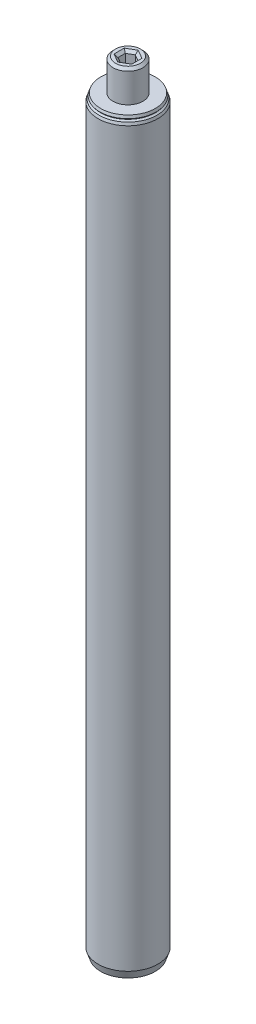
ISO-10303-21;
HEADER;
FILE_DESCRIPTION(('STEP AP214'),'2;1');
FILE_NAME('part.step','',(''),(''),'','','');
FILE_SCHEMA(('AUTOMOTIVE_DESIGN { 1 0 10303 214 1 1 1 1 }'));
ENDSEC;
DATA;
#1=APPLICATION_CONTEXT('core data for automotive mechanical design processes');
#2=APPLICATION_PROTOCOL_DEFINITION('international standard','automotive_design',2000,#1);
#3=PRODUCT_CONTEXT('',#1,'mechanical');
#4=PRODUCT('Part','Part','',(#3));
#5=PRODUCT_RELATED_PRODUCT_CATEGORY('part','',(#4));
#6=PRODUCT_DEFINITION_FORMATION('','',#4);
#7=PRODUCT_DEFINITION_CONTEXT('part definition',#1,'design');
#8=PRODUCT_DEFINITION('design','',#6,#7);
#9=PRODUCT_DEFINITION_SHAPE('','',#8);
#10=(LENGTH_UNIT() NAMED_UNIT(*) SI_UNIT(.MILLI.,.METRE.));
#11=(NAMED_UNIT(*) PLANE_ANGLE_UNIT() SI_UNIT($,.RADIAN.));
#12=(NAMED_UNIT(*) SI_UNIT($,.STERADIAN.) SOLID_ANGLE_UNIT());
#13=UNCERTAINTY_MEASURE_WITH_UNIT(LENGTH_MEASURE(1.E-05),#10,'distance_accuracy_value','');
#14=(GEOMETRIC_REPRESENTATION_CONTEXT(3) GLOBAL_UNCERTAINTY_ASSIGNED_CONTEXT((#13)) GLOBAL_UNIT_ASSIGNED_CONTEXT((#10,
#11,#12)) REPRESENTATION_CONTEXT('',''));
#15=CARTESIAN_POINT('',(0.,0.,0.));
#16=DIRECTION('',(0.,0.,1.));
#17=DIRECTION('',(1.,0.,0.));
#18=AXIS2_PLACEMENT_3D('',#15,#16,#17);
#19=CARTESIAN_POINT('',(-1.29903810567666,70.1812,0.749999999999999));
#20=DIRECTION('',(0.,1.,0.));
#21=DIRECTION('',(0.5,0.,0.866025403784439));
#22=AXIS2_PLACEMENT_3D('',#19,#20,#21);
#23=PLANE('',#22);
#24=CARTESIAN_POINT('',(0.,70.1812,0.));
#25=DIRECTION('',(0.,1.,0.));
#26=DIRECTION('',(0.5,0.,0.866025403784439));
#27=AXIS2_PLACEMENT_3D('',#24,#25,#26);
#28=CIRCLE('',#27,1.246);
#29=CARTESIAN_POINT('',(0.623,70.1812,1.07906765311541));
#30=VERTEX_POINT('',#29);
#31=EDGE_CURVE('P0_E126',#30,#30,#28,.F.);
#32=ORIENTED_EDGE('',*,*,#31,.T.);
#33=EDGE_LOOP('',(#32));
#34=FACE_BOUND('',#33,.T.);
#35=ADVANCED_FACE('P0_F16',(#34),#23,.F.);
#36=CARTESIAN_POINT('',(0.,78.1812,0.));
#37=DIRECTION('',(0.,-1.,0.));
#38=DIRECTION('',(-0.5,0.,-0.866025403784439));
#39=AXIS2_PLACEMENT_3D('',#36,#37,#38);
#40=PLANE('',#39);
#41=DIRECTION('',(0.866025403784439,0.,0.5));
#42=VECTOR('',#41,1.);
#43=CARTESIAN_POINT('',(0.444500000000001,78.1812,-0.769896583964367));
#44=LINE('',#43,#42);
#45=CARTESIAN_POINT('',(0.,78.1812,-1.02652877861916));
#46=VERTEX_POINT('',#45);
#47=CARTESIAN_POINT('',(0.889000000000001,78.1812,-0.513264389309577));
#48=VERTEX_POINT('',#47);
#49=EDGE_CURVE('P0_E157',#46,#48,#44,.T.);
#50=ORIENTED_EDGE('',*,*,#49,.T.);
#51=DIRECTION('',(0.,0.,1.));
#52=VECTOR('',#51,1.);
#53=CARTESIAN_POINT('',(0.889000000000001,78.1812,0.));
#54=LINE('',#53,#52);
#55=CARTESIAN_POINT('',(0.889000000000001,78.1812,0.513264389309578));
#56=VERTEX_POINT('',#55);
#57=EDGE_CURVE('P0_E159',#48,#56,#54,.T.);
#58=ORIENTED_EDGE('',*,*,#57,.T.);
#59=DIRECTION('',(-0.866025403784439,0.,0.5));
#60=VECTOR('',#59,1.);
#61=CARTESIAN_POINT('',(0.4445,78.1812,0.769896583964367));
#62=LINE('',#61,#60);
#63=CARTESIAN_POINT('',(0.,78.1812,1.02652877861916));
#64=VERTEX_POINT('',#63);
#65=EDGE_CURVE('P0_E149',#56,#64,#62,.T.);
#66=ORIENTED_EDGE('',*,*,#65,.T.);
#67=DIRECTION('',(-0.866025403784439,0.,-0.5));
#68=VECTOR('',#67,1.);
#69=CARTESIAN_POINT('',(-0.444500000000001,78.1812,0.769896583964367));
#70=LINE('',#69,#68);
#71=CARTESIAN_POINT('',(-0.889000000000001,78.1812,0.513264389309578));
#72=VERTEX_POINT('',#71);
#73=EDGE_CURVE('P0_E151',#64,#72,#70,.T.);
#74=ORIENTED_EDGE('',*,*,#73,.T.);
#75=DIRECTION('',(0.,0.,-1.));
#76=VECTOR('',#75,1.);
#77=CARTESIAN_POINT('',(-0.889000000000001,78.1812,0.));
#78=LINE('',#77,#76);
#79=CARTESIAN_POINT('',(-0.889000000000001,78.1812,-0.513264389309578));
#80=VERTEX_POINT('',#79);
#81=EDGE_CURVE('P0_E153',#72,#80,#78,.T.);
#82=ORIENTED_EDGE('',*,*,#81,.T.);
#83=DIRECTION('',(0.866025403784439,0.,-0.499999999999999));
#84=VECTOR('',#83,1.);
#85=CARTESIAN_POINT('',(-0.4445,78.1812,-0.769896583964367));
#86=LINE('',#85,#84);
#87=EDGE_CURVE('P0_E155',#80,#46,#86,.T.);
#88=ORIENTED_EDGE('',*,*,#87,.T.);
#89=EDGE_LOOP('',(#50,#58,#66,#74,#82,#88));
#90=FACE_BOUND('',#89,.T.);
#91=CARTESIAN_POINT('',(0.,78.1812,0.));
#92=DIRECTION('',(0.,-1.,0.));
#93=DIRECTION('',(-0.5,0.,-0.866025403784439));
#94=AXIS2_PLACEMENT_3D('',#91,#92,#93);
#95=CIRCLE('',#94,1.246);
#96=CARTESIAN_POINT('',(-0.623,78.1812,-1.07906765311541));
#97=VERTEX_POINT('',#96);
#98=EDGE_CURVE('P0_E143',#97,#97,#95,.F.);
#99=ORIENTED_EDGE('',*,*,#98,.T.);
#100=EDGE_LOOP('',(#99));
#101=FACE_BOUND('',#100,.T.);
#102=ADVANCED_FACE('P0_F208',(#90,#101),#40,.F.);
#103=CARTESIAN_POINT('',(0.,70.1812,0.));
#104=DIRECTION('',(0.,-1.,0.));
#105=DIRECTION('',(-0.5,0.,-0.866025403784439));
#106=AXIS2_PLACEMENT_3D('',#103,#104,#105);
#107=CYLINDRICAL_SURFACE('',#106,1.5);
#108=CARTESIAN_POINT('',(0.,70.4352,0.));
#109=DIRECTION('',(0.,1.,0.));
#110=DIRECTION('',(0.5,0.,0.866025403784439));
#111=AXIS2_PLACEMENT_3D('',#108,#109,#110);
#112=CIRCLE('',#111,1.5);
#113=CARTESIAN_POINT('',(0.749999999999999,70.4352,1.29903810567666));
#114=VERTEX_POINT('',#113);
#115=EDGE_CURVE('P0_E140',#114,#114,#112,.T.);
#116=ORIENTED_EDGE('',*,*,#115,.T.);
#117=EDGE_LOOP('',(#116));
#118=FACE_BOUND('',#117,.T.);
#119=CARTESIAN_POINT('',(0.,77.9272,0.));
#120=DIRECTION('',(0.,-1.,0.));
#121=DIRECTION('',(-0.5,0.,-0.866025403784439));
#122=AXIS2_PLACEMENT_3D('',#119,#120,#121);
#123=CIRCLE('',#122,1.5);
#124=CARTESIAN_POINT('',(-0.749999999999999,77.9272,-1.29903810567666));
#125=VERTEX_POINT('',#124);
#126=EDGE_CURVE('P0_E137',#125,#125,#123,.T.);
#127=ORIENTED_EDGE('',*,*,#126,.T.);
#128=EDGE_LOOP('',(#127));
#129=FACE_BOUND('',#128,.T.);
#130=ADVANCED_FACE('P0_F211',(#118,#129),#107,.T.);
#131=CARTESIAN_POINT('',(0.,70.1812,0.));
#132=DIRECTION('',(0.,1.,0.));
#133=DIRECTION('',(0.5,0.,0.866025403784439));
#134=AXIS2_PLACEMENT_3D('',#131,#132,#133);
#135=CONICAL_SURFACE('',#134,1.246,0.785398163397446);
#136=ORIENTED_EDGE('',*,*,#115,.F.);
#137=EDGE_LOOP('',(#136));
#138=FACE_BOUND('',#137,.T.);
#139=ORIENTED_EDGE('',*,*,#31,.F.);
#140=EDGE_LOOP('',(#139));
#141=FACE_BOUND('',#140,.T.);
#142=ADVANCED_FACE('P0_F218',(#138,#141),#135,.T.);
#143=CARTESIAN_POINT('',(0.,77.9272,0.));
#144=DIRECTION('',(0.,-1.,0.));
#145=DIRECTION('',(-0.5,0.,-0.866025403784439));
#146=AXIS2_PLACEMENT_3D('',#143,#144,#145);
#147=CONICAL_SURFACE('',#146,1.5,0.785398163397447);
#148=ORIENTED_EDGE('',*,*,#98,.F.);
#149=EDGE_LOOP('',(#148));
#150=FACE_BOUND('',#149,.T.);
#151=ORIENTED_EDGE('',*,*,#126,.F.);
#152=EDGE_LOOP('',(#151));
#153=FACE_BOUND('',#152,.T.);
#154=ADVANCED_FACE('P0_F215',(#150,#153),#147,.T.);
#155=CARTESIAN_POINT('',(0.635,76.9112,-0.366617420935412));
#156=DIRECTION('',(0.5,0.,-0.866025403784438));
#157=DIRECTION('',(-0.866025403784439,0.,-0.5));
#158=AXIS2_PLACEMENT_3D('',#155,#156,#157);
#159=PLANE('',#158);
#160=DIRECTION('',(0.,1.,0.));
#161=VECTOR('',#160,1.);
#162=CARTESIAN_POINT('',(0.635,76.9112,-0.366617420935412));
#163=LINE('',#162,#161);
#164=CARTESIAN_POINT('',(0.635,76.9112,-0.366617420935412));
#165=VERTEX_POINT('',#164);
#166=CARTESIAN_POINT('',(0.635,77.9272,-0.366617420935412));
#167=VERTEX_POINT('',#166);
#168=EDGE_CURVE('P0_E124',#165,#167,#163,.T.);
#169=ORIENTED_EDGE('',*,*,#168,.T.);
#170=DIRECTION('',(-0.866025403784439,0.,-0.5));
#171=VECTOR('',#170,1.);
#172=CARTESIAN_POINT('',(0.635,77.9272,-0.366617420935412));
#173=LINE('',#172,#171);
#174=CARTESIAN_POINT('',(0.,77.9272,-0.733234841870825));
#175=VERTEX_POINT('',#174);
#176=EDGE_CURVE('P0_E96',#167,#175,#173,.T.);
#177=ORIENTED_EDGE('',*,*,#176,.T.);
#178=DIRECTION('',(0.,1.,0.));
#179=VECTOR('',#178,1.);
#180=CARTESIAN_POINT('',(0.,76.9112,-0.733234841870825));
#181=LINE('',#180,#179);
#182=CARTESIAN_POINT('',(0.,76.9112,-0.733234841870825));
#183=VERTEX_POINT('',#182);
#184=EDGE_CURVE('P0_E88',#183,#175,#181,.T.);
#185=ORIENTED_EDGE('',*,*,#184,.F.);
#186=DIRECTION('',(-0.866025403784439,0.,-0.5));
#187=VECTOR('',#186,1.);
#188=CARTESIAN_POINT('',(0.635,76.9112,-0.366617420935412));
#189=LINE('',#188,#187);
#190=EDGE_CURVE('P0_E93',#165,#183,#189,.T.);
#191=ORIENTED_EDGE('',*,*,#190,.F.);
#192=EDGE_LOOP('',(#169,#177,#185,#191));
#193=FACE_BOUND('',#192,.T.);
#194=ADVANCED_FACE('P0_F91',(#193),#159,.F.);
#195=CARTESIAN_POINT('',(0.635,76.9112,0.366617420935413));
#196=DIRECTION('',(1.,0.,0.));
#197=DIRECTION('',(0.,0.,-1.));
#198=AXIS2_PLACEMENT_3D('',#195,#196,#197);
#199=PLANE('',#198);
#200=DIRECTION('',(0.,1.,0.));
#201=VECTOR('',#200,1.);
#202=CARTESIAN_POINT('',(0.635,76.9112,0.366617420935413));
#203=LINE('',#202,#201);
#204=CARTESIAN_POINT('',(0.635,76.9112,0.366617420935413));
#205=VERTEX_POINT('',#204);
#206=CARTESIAN_POINT('',(0.635,77.9272,0.366617420935413));
#207=VERTEX_POINT('',#206);
#208=EDGE_CURVE('P0_E127',#205,#207,#203,.T.);
#209=ORIENTED_EDGE('',*,*,#208,.T.);
#210=DIRECTION('',(0.,0.,-1.));
#211=VECTOR('',#210,1.);
#212=CARTESIAN_POINT('',(0.635,77.9272,0.366617420935413));
#213=LINE('',#212,#211);
#214=EDGE_CURVE('P0_E146',#207,#167,#213,.T.);
#215=ORIENTED_EDGE('',*,*,#214,.T.);
#216=ORIENTED_EDGE('',*,*,#168,.F.);
#217=DIRECTION('',(0.,0.,-1.));
#218=VECTOR('',#217,1.);
#219=CARTESIAN_POINT('',(0.635,76.9112,0.366617420935413));
#220=LINE('',#219,#218);
#221=EDGE_CURVE('P0_E100',#205,#165,#220,.T.);
#222=ORIENTED_EDGE('',*,*,#221,.F.);
#223=EDGE_LOOP('',(#209,#215,#216,#222));
#224=FACE_BOUND('',#223,.T.);
#225=ADVANCED_FACE('P0_F199',(#224),#199,.F.);
#226=CARTESIAN_POINT('',(0.,76.9112,0.733234841870825));
#227=DIRECTION('',(0.5,0.,0.866025403784439));
#228=DIRECTION('',(0.866025403784439,0.,-0.5));
#229=AXIS2_PLACEMENT_3D('',#226,#227,#228);
#230=PLANE('',#229);
#231=DIRECTION('',(0.,1.,0.));
#232=VECTOR('',#231,1.);
#233=CARTESIAN_POINT('',(0.,76.9112,0.733234841870825));
#234=LINE('',#233,#232);
#235=CARTESIAN_POINT('',(0.,76.9112,0.733234841870825));
#236=VERTEX_POINT('',#235);
#237=CARTESIAN_POINT('',(0.,77.9272,0.733234841870825));
#238=VERTEX_POINT('',#237);
#239=EDGE_CURVE('P0_E130',#236,#238,#234,.T.);
#240=ORIENTED_EDGE('',*,*,#239,.T.);
#241=DIRECTION('',(0.866025403784439,0.,-0.5));
#242=VECTOR('',#241,1.);
#243=CARTESIAN_POINT('',(0.,77.9272,0.733234841870825));
#244=LINE('',#243,#242);
#245=EDGE_CURVE('P0_E10',#238,#207,#244,.T.);
#246=ORIENTED_EDGE('',*,*,#245,.T.);
#247=ORIENTED_EDGE('',*,*,#208,.F.);
#248=DIRECTION('',(0.866025403784439,0.,-0.5));
#249=VECTOR('',#248,1.);
#250=CARTESIAN_POINT('',(0.,76.9112,0.733234841870825));
#251=LINE('',#250,#249);
#252=EDGE_CURVE('P0_E121',#236,#205,#251,.T.);
#253=ORIENTED_EDGE('',*,*,#252,.F.);
#254=EDGE_LOOP('',(#240,#246,#247,#253));
#255=FACE_BOUND('',#254,.T.);
#256=ADVANCED_FACE('P0_F196',(#255),#230,.F.);
#257=CARTESIAN_POINT('',(-0.635,76.9112,0.366617420935412));
#258=DIRECTION('',(-0.5,0.,0.866025403784438));
#259=DIRECTION('',(0.866025403784438,0.,0.5));
#260=AXIS2_PLACEMENT_3D('',#257,#258,#259);
#261=PLANE('',#260);
#262=DIRECTION('',(0.,1.,0.));
#263=VECTOR('',#262,1.);
#264=CARTESIAN_POINT('',(-0.635,76.9112,0.366617420935412));
#265=LINE('',#264,#263);
#266=CARTESIAN_POINT('',(-0.635,76.9112,0.366617420935412));
#267=VERTEX_POINT('',#266);
#268=CARTESIAN_POINT('',(-0.635,77.9272,0.366617420935412));
#269=VERTEX_POINT('',#268);
#270=EDGE_CURVE('P0_E132',#267,#269,#265,.T.);
#271=ORIENTED_EDGE('',*,*,#270,.T.);
#272=DIRECTION('',(0.866025403784438,0.,0.5));
#273=VECTOR('',#272,1.);
#274=CARTESIAN_POINT('',(-0.635,77.9272,0.366617420935412));
#275=LINE('',#274,#273);
#276=EDGE_CURVE('P0_E25',#269,#238,#275,.T.);
#277=ORIENTED_EDGE('',*,*,#276,.T.);
#278=ORIENTED_EDGE('',*,*,#239,.F.);
#279=DIRECTION('',(0.866025403784439,0.,0.5));
#280=VECTOR('',#279,1.);
#281=CARTESIAN_POINT('',(-0.635,76.9112,0.366617420935412));
#282=LINE('',#281,#280);
#283=EDGE_CURVE('P0_E118',#267,#236,#282,.T.);
#284=ORIENTED_EDGE('',*,*,#283,.F.);
#285=EDGE_LOOP('',(#271,#277,#278,#284));
#286=FACE_BOUND('',#285,.T.);
#287=ADVANCED_FACE('P0_F263',(#286),#261,.F.);
#288=CARTESIAN_POINT('',(-0.635,76.9112,-0.366617420935413));
#289=DIRECTION('',(-1.,0.,0.));
#290=DIRECTION('',(0.,0.,1.));
#291=AXIS2_PLACEMENT_3D('',#288,#289,#290);
#292=PLANE('',#291);
#293=DIRECTION('',(0.,1.,0.));
#294=VECTOR('',#293,1.);
#295=CARTESIAN_POINT('',(-0.635,76.9112,-0.366617420935413));
#296=LINE('',#295,#294);
#297=CARTESIAN_POINT('',(-0.635,76.9112,-0.366617420935413));
#298=VERTEX_POINT('',#297);
#299=CARTESIAN_POINT('',(-0.635,77.9272,-0.366617420935413));
#300=VERTEX_POINT('',#299);
#301=EDGE_CURVE('P0_E99',#298,#300,#296,.T.);
#302=ORIENTED_EDGE('',*,*,#301,.T.);
#303=DIRECTION('',(0.,0.,1.));
#304=VECTOR('',#303,1.);
#305=CARTESIAN_POINT('',(-0.635,77.9272,-0.366617420935413));
#306=LINE('',#305,#304);
#307=EDGE_CURVE('P0_E40',#300,#269,#306,.T.);
#308=ORIENTED_EDGE('',*,*,#307,.T.);
#309=ORIENTED_EDGE('',*,*,#270,.F.);
#310=DIRECTION('',(0.,0.,1.));
#311=VECTOR('',#310,1.);
#312=CARTESIAN_POINT('',(-0.635,76.9112,-0.366617420935413));
#313=LINE('',#312,#311);
#314=EDGE_CURVE('P0_E108',#298,#267,#313,.T.);
#315=ORIENTED_EDGE('',*,*,#314,.F.);
#316=EDGE_LOOP('',(#302,#308,#309,#315));
#317=FACE_BOUND('',#316,.T.);
#318=ADVANCED_FACE('P0_F256',(#317),#292,.F.);
#319=CARTESIAN_POINT('',(0.,76.9112,-0.733234841870825));
#320=DIRECTION('',(-0.499999999999999,0.,-0.866025403784439));
#321=DIRECTION('',(-0.866025403784439,0.,0.499999999999999));
#322=AXIS2_PLACEMENT_3D('',#319,#320,#321);
#323=PLANE('',#322);
#324=ORIENTED_EDGE('',*,*,#184,.T.);
#325=DIRECTION('',(-0.866025403784439,0.,0.499999999999999));
#326=VECTOR('',#325,1.);
#327=CARTESIAN_POINT('',(0.,77.9272,-0.733234841870825));
#328=LINE('',#327,#326);
#329=EDGE_CURVE('P0_E163',#175,#300,#328,.T.);
#330=ORIENTED_EDGE('',*,*,#329,.T.);
#331=ORIENTED_EDGE('',*,*,#301,.F.);
#332=DIRECTION('',(-0.866025403784439,0.,0.499999999999999));
#333=VECTOR('',#332,1.);
#334=CARTESIAN_POINT('',(0.,76.9112,-0.733234841870825));
#335=LINE('',#334,#333);
#336=EDGE_CURVE('P0_E103',#183,#298,#335,.T.);
#337=ORIENTED_EDGE('',*,*,#336,.F.);
#338=EDGE_LOOP('',(#324,#330,#331,#337));
#339=FACE_BOUND('',#338,.T.);
#340=ADVANCED_FACE('P0_F104',(#339),#323,.F.);
#341=CARTESIAN_POINT('',(1.27,76.9112,0.));
#342=DIRECTION('',(0.,-1.,0.));
#343=DIRECTION('',(-0.5,0.,-0.866025403784439));
#344=AXIS2_PLACEMENT_3D('',#341,#342,#343);
#345=PLANE('',#344);
#346=ORIENTED_EDGE('',*,*,#190,.T.);
#347=ORIENTED_EDGE('',*,*,#336,.T.);
#348=ORIENTED_EDGE('',*,*,#314,.T.);
#349=ORIENTED_EDGE('',*,*,#283,.T.);
#350=ORIENTED_EDGE('',*,*,#252,.T.);
#351=ORIENTED_EDGE('',*,*,#221,.T.);
#352=EDGE_LOOP('',(#346,#347,#348,#349,#350,#351));
#353=FACE_BOUND('',#352,.T.);
#354=ADVANCED_FACE('P0_F110',(#353),#345,.F.);
#355=CARTESIAN_POINT('',(-0.635,77.9272,-0.366617420935413));
#356=DIRECTION('',(-0.707106781186546,-0.707106781186549,0.));
#357=DIRECTION('',(0.654653670707978,-0.654653670707976,-0.377964473009228));
#358=AXIS2_PLACEMENT_3D('',#355,#356,#357);
#359=PLANE('',#358);
#360=DIRECTION('',(-0.654653670707978,0.654653670707976,-0.377964473009228));
#361=VECTOR('',#360,1.);
#362=CARTESIAN_POINT('',(-0.453571428571428,77.7457714285714,-0.261869586382437));
#363=LINE('',#362,#361);
#364=EDGE_CURVE('P0_E115',#80,#300,#363,.F.);
#365=ORIENTED_EDGE('',*,*,#364,.F.);
#366=ORIENTED_EDGE('',*,*,#81,.F.);
#367=DIRECTION('',(-0.654653670707979,0.654653670707976,0.377964473009227));
#368=VECTOR('',#367,1.);
#369=CARTESIAN_POINT('',(-0.453571428571428,77.7457714285714,0.261869586382437));
#370=LINE('',#369,#368);
#371=EDGE_CURVE('P0_E20',#269,#72,#370,.T.);
#372=ORIENTED_EDGE('',*,*,#371,.F.);
#373=ORIENTED_EDGE('',*,*,#307,.F.);
#374=EDGE_LOOP('',(#365,#366,#372,#373));
#375=FACE_BOUND('',#374,.T.);
#376=ADVANCED_FACE('P0_F18',(#375),#359,.F.);
#377=CARTESIAN_POINT('',(-0.635,77.9272,0.366617420935412));
#378=DIRECTION('',(-0.353553390593273,-0.707106781186549,0.612372435695793));
#379=DIRECTION('',(0.654653670707978,-0.654653670707976,-0.377964473009227));
#380=AXIS2_PLACEMENT_3D('',#377,#378,#379);
#381=PLANE('',#380);
#382=ORIENTED_EDGE('',*,*,#371,.T.);
#383=ORIENTED_EDGE('',*,*,#73,.F.);
#384=DIRECTION('',(0.,0.654653670707976,0.755928946018456));
#385=VECTOR('',#384,1.);
#386=CARTESIAN_POINT('',(0.,77.7457714285714,0.523739172764874));
#387=LINE('',#386,#385);
#388=EDGE_CURVE('P0_E174',#238,#64,#387,.T.);
#389=ORIENTED_EDGE('',*,*,#388,.F.);
#390=ORIENTED_EDGE('',*,*,#276,.F.);
#391=EDGE_LOOP('',(#382,#383,#389,#390));
#392=FACE_BOUND('',#391,.T.);
#393=ADVANCED_FACE('P0_F188',(#392),#381,.F.);
#394=CARTESIAN_POINT('',(0.,77.9272,-0.733234841870825));
#395=DIRECTION('',(-0.353553390593273,-0.707106781186549,-0.612372435695793));
#396=DIRECTION('',(-0.353553390593274,0.707106781186546,-0.612372435695796));
#397=AXIS2_PLACEMENT_3D('',#394,#395,#396);
#398=PLANE('',#397);
#399=ORIENTED_EDGE('',*,*,#364,.T.);
#400=ORIENTED_EDGE('',*,*,#329,.F.);
#401=DIRECTION('',(0.,0.654653670707976,-0.755928946018456));
#402=VECTOR('',#401,1.);
#403=CARTESIAN_POINT('',(0.,77.7457714285714,-0.523739172764874));
#404=LINE('',#403,#402);
#405=EDGE_CURVE('P0_E171',#46,#175,#404,.F.);
#406=ORIENTED_EDGE('',*,*,#405,.F.);
#407=ORIENTED_EDGE('',*,*,#87,.F.);
#408=EDGE_LOOP('',(#399,#400,#406,#407));
#409=FACE_BOUND('',#408,.T.);
#410=ADVANCED_FACE('P0_F180',(#409),#398,.F.);
#411=CARTESIAN_POINT('',(0.,77.9272,0.733234841870825));
#412=DIRECTION('',(0.353553390593273,-0.707106781186549,0.612372435695794));
#413=DIRECTION('',(-0.353553390593274,-0.707106781186546,-0.612372435695796));
#414=AXIS2_PLACEMENT_3D('',#411,#412,#413);
#415=PLANE('',#414);
#416=ORIENTED_EDGE('',*,*,#388,.T.);
#417=ORIENTED_EDGE('',*,*,#65,.F.);
#418=DIRECTION('',(-0.654653670707978,-0.654653670707976,-0.377964473009228));
#419=VECTOR('',#418,1.);
#420=CARTESIAN_POINT('',(0.635,77.9272,0.366617420935413));
#421=LINE('',#420,#419);
#422=EDGE_CURVE('P0_E169',#207,#56,#421,.F.);
#423=ORIENTED_EDGE('',*,*,#422,.F.);
#424=ORIENTED_EDGE('',*,*,#245,.F.);
#425=EDGE_LOOP('',(#416,#417,#423,#424));
#426=FACE_BOUND('',#425,.T.);
#427=ADVANCED_FACE('P0_F193',(#426),#415,.F.);
#428=CARTESIAN_POINT('',(0.635,77.9272,-0.366617420935412));
#429=DIRECTION('',(0.353553390593273,-0.707106781186549,-0.612372435695793));
#430=DIRECTION('',(0.654653670707978,0.654653670707976,-0.377964473009227));
#431=AXIS2_PLACEMENT_3D('',#428,#429,#430);
#432=PLANE('',#431);
#433=ORIENTED_EDGE('',*,*,#405,.T.);
#434=ORIENTED_EDGE('',*,*,#176,.F.);
#435=DIRECTION('',(0.654653670707979,0.654653670707976,-0.377964473009227));
#436=VECTOR('',#435,1.);
#437=CARTESIAN_POINT('',(0.453571428571428,77.7457714285714,-0.261869586382437));
#438=LINE('',#437,#436);
#439=EDGE_CURVE('P0_E167',#48,#167,#438,.F.);
#440=ORIENTED_EDGE('',*,*,#439,.F.);
#441=ORIENTED_EDGE('',*,*,#49,.F.);
#442=EDGE_LOOP('',(#433,#434,#440,#441));
#443=FACE_BOUND('',#442,.T.);
#444=ADVANCED_FACE('P0_F206',(#443),#432,.F.);
#445=CARTESIAN_POINT('',(0.635,77.9272,0.366617420935413));
#446=DIRECTION('',(0.707106781186546,-0.707106781186549,0.));
#447=DIRECTION('',(0.654653670707978,0.654653670707976,-0.377964473009228));
#448=AXIS2_PLACEMENT_3D('',#445,#446,#447);
#449=PLANE('',#448);
#450=ORIENTED_EDGE('',*,*,#422,.T.);
#451=ORIENTED_EDGE('',*,*,#57,.F.);
#452=ORIENTED_EDGE('',*,*,#439,.T.);
#453=ORIENTED_EDGE('',*,*,#214,.F.);
#454=EDGE_LOOP('',(#450,#451,#452,#453));
#455=FACE_BOUND('',#454,.T.);
#456=ADVANCED_FACE('P0_F201',(#455),#449,.F.);
#457=CLOSED_SHELL('',(#35,#102,#130,#142,#154,#194,#225,#256,#287,#318,#340,#354,#376,#393,#410,
#427,#444,#456));
#458=MANIFOLD_SOLID_BREP('P0_B1',#457);
#459=CARTESIAN_POINT('',(0.,75.0062,0.));
#460=DIRECTION('',(0.,-1.,0.));
#461=DIRECTION('',(0.,0.,-1.));
#462=AXIS2_PLACEMENT_3D('',#459,#460,#461);
#463=PLANE('',#462);
#464=CARTESIAN_POINT('',(0.,75.0062,0.));
#465=DIRECTION('',(0.,-1.,0.));
#466=DIRECTION('',(0.,0.,-1.));
#467=AXIS2_PLACEMENT_3D('',#464,#465,#466);
#468=CIRCLE('',#467,1.50399999999999);
#469=CARTESIAN_POINT('',(0.,75.0062,-1.50399999999999));
#470=VERTEX_POINT('',#469);
#471=EDGE_CURVE('P1_E11',#470,#470,#468,.T.);
#472=ORIENTED_EDGE('',*,*,#471,.T.);
#473=EDGE_LOOP('',(#472));
#474=FACE_BOUND('',#473,.T.);
#475=CARTESIAN_POINT('',(0.,75.0062,0.));
#476=DIRECTION('',(0.,1.,0.));
#477=DIRECTION('',(0.,0.,1.));
#478=AXIS2_PLACEMENT_3D('',#475,#476,#477);
#479=CIRCLE('',#478,2.74319999999997);
#480=CARTESIAN_POINT('',(0.,75.0062,2.74319999999997));
#481=VERTEX_POINT('',#480);
#482=EDGE_CURVE('P1_E64',#481,#481,#479,.T.);
#483=ORIENTED_EDGE('',*,*,#482,.T.);
#484=EDGE_LOOP('',(#483));
#485=FACE_BOUND('',#484,.T.);
#486=ADVANCED_FACE('P1_F17',(#474,#485),#463,.F.);
#487=CARTESIAN_POINT('',(0.,74.7456827788524,0.));
#488=DIRECTION('',(0.,-1.,0.));
#489=DIRECTION('',(0.,0.,-1.));
#490=AXIS2_PLACEMENT_3D('',#487,#488,#489);
#491=CONICAL_SURFACE('',#490,2.83003907371583,0.321750554396634);
#492=ORIENTED_EDGE('',*,*,#482,.F.);
#493=EDGE_LOOP('',(#492));
#494=FACE_BOUND('',#493,.T.);
#495=CARTESIAN_POINT('',(0.,74.7456827788524,0.));
#496=DIRECTION('',(0.,1.,0.));
#497=DIRECTION('',(0.,0.,1.));
#498=AXIS2_PLACEMENT_3D('',#495,#496,#497);
#499=CIRCLE('',#498,2.83003907371583);
#500=CARTESIAN_POINT('',(0.,74.7456827788524,2.83003907371583));
#501=VERTEX_POINT('',#500);
#502=EDGE_CURVE('P1_E61',#501,#501,#499,.T.);
#503=ORIENTED_EDGE('',*,*,#502,.T.);
#504=EDGE_LOOP('',(#503));
#505=FACE_BOUND('',#504,.T.);
#506=ADVANCED_FACE('P1_F85',(#494,#505),#491,.T.);
#507=CARTESIAN_POINT('',(0.,74.6252,0.));
#508=DIRECTION('',(0.,1.,0.));
#509=DIRECTION('',(0.,0.,1.));
#510=AXIS2_PLACEMENT_3D('',#507,#508,#509);
#511=CONICAL_SURFACE('',#510,2.74319999999997,0.624522886199143);
#512=ORIENTED_EDGE('',*,*,#502,.F.);
#513=EDGE_LOOP('',(#512));
#514=FACE_BOUND('',#513,.T.);
#515=CARTESIAN_POINT('',(0.,74.6252,0.));
#516=DIRECTION('',(0.,1.,0.));
#517=DIRECTION('',(0.,0.,1.));
#518=AXIS2_PLACEMENT_3D('',#515,#516,#517);
#519=CIRCLE('',#518,2.74319999999997);
#520=CARTESIAN_POINT('',(0.,74.6252,2.74319999999997));
#521=VERTEX_POINT('',#520);
#522=EDGE_CURVE('P1_E58',#521,#521,#519,.T.);
#523=ORIENTED_EDGE('',*,*,#522,.T.);
#524=EDGE_LOOP('',(#523));
#525=FACE_BOUND('',#524,.T.);
#526=ADVANCED_FACE('P1_F91',(#514,#525),#511,.T.);
#527=CARTESIAN_POINT('',(0.,74.5047172211476,0.));
#528=DIRECTION('',(0.,-1.,0.));
#529=DIRECTION('',(0.,0.,-1.));
#530=AXIS2_PLACEMENT_3D('',#527,#528,#529);
#531=CONICAL_SURFACE('',#530,2.91036092628411,0.946273440595758);
#532=ORIENTED_EDGE('',*,*,#522,.F.);
#533=EDGE_LOOP('',(#532));
#534=FACE_BOUND('',#533,.T.);
#535=CARTESIAN_POINT('',(0.,74.5047172211476,0.));
#536=DIRECTION('',(0.,1.,0.));
#537=DIRECTION('',(0.,0.,1.));
#538=AXIS2_PLACEMENT_3D('',#535,#536,#537);
#539=CIRCLE('',#538,2.91036092628411);
#540=CARTESIAN_POINT('',(0.,74.5047172211476,2.91036092628411));
#541=VERTEX_POINT('',#540);
#542=EDGE_CURVE('P1_E55',#541,#541,#539,.T.);
#543=ORIENTED_EDGE('',*,*,#542,.T.);
#544=EDGE_LOOP('',(#543));
#545=FACE_BOUND('',#544,.T.);
#546=ADVANCED_FACE('P1_F98',(#534,#545),#531,.T.);
#547=CARTESIAN_POINT('',(0.,74.2442,0.));
#548=DIRECTION('',(0.,-1.,0.));
#549=DIRECTION('',(0.,0.,-1.));
#550=AXIS2_PLACEMENT_3D('',#547,#548,#549);
#551=CONICAL_SURFACE('',#550,2.99719999999997,0.321750554396655);
#552=ORIENTED_EDGE('',*,*,#542,.F.);
#553=EDGE_LOOP('',(#552));
#554=FACE_BOUND('',#553,.T.);
#555=CARTESIAN_POINT('',(0.,74.2442,0.));
#556=DIRECTION('',(0.,1.,0.));
#557=DIRECTION('',(0.,0.,1.));
#558=AXIS2_PLACEMENT_3D('',#555,#556,#557);
#559=CIRCLE('',#558,2.99719999999997);
#560=CARTESIAN_POINT('',(0.,74.2442,2.99719999999997));
#561=VERTEX_POINT('',#560);
#562=EDGE_CURVE('P1_E52',#561,#561,#559,.T.);
#563=ORIENTED_EDGE('',*,*,#562,.T.);
#564=EDGE_LOOP('',(#563));
#565=FACE_BOUND('',#564,.T.);
#566=ADVANCED_FACE('P1_F102',(#554,#565),#551,.T.);
#567=CARTESIAN_POINT('',(0.,75.0062,0.));
#568=DIRECTION('',(0.,1.,0.));
#569=DIRECTION('',(0.,0.,1.));
#570=AXIS2_PLACEMENT_3D('',#567,#568,#569);
#571=CYLINDRICAL_SURFACE('',#570,2.99719999999997);
#572=ORIENTED_EDGE('',*,*,#562,.F.);
#573=EDGE_LOOP('',(#572));
#574=FACE_BOUND('',#573,.T.);
#575=CARTESIAN_POINT('',(0.,0.761999999999999,0.));
#576=DIRECTION('',(0.,1.,0.));
#577=DIRECTION('',(0.,0.,1.));
#578=AXIS2_PLACEMENT_3D('',#575,#576,#577);
#579=CIRCLE('',#578,2.99719999999997);
#580=CARTESIAN_POINT('',(0.,0.761999999999999,2.99719999999997));
#581=VERTEX_POINT('',#580);
#582=EDGE_CURVE('P1_E49',#581,#581,#579,.T.);
#583=ORIENTED_EDGE('',*,*,#582,.T.);
#584=EDGE_LOOP('',(#583));
#585=FACE_BOUND('',#584,.T.);
#586=ADVANCED_FACE('P1_F106',(#574,#585),#571,.T.);
#587=CARTESIAN_POINT('',(0.,0.,0.));
#588=DIRECTION('',(0.,1.,0.));
#589=DIRECTION('',(0.,0.,1.));
#590=AXIS2_PLACEMENT_3D('',#587,#588,#589);
#591=CONICAL_SURFACE('',#590,2.74319999999997,0.321750554396644);
#592=ORIENTED_EDGE('',*,*,#582,.F.);
#593=EDGE_LOOP('',(#592));
#594=FACE_BOUND('',#593,.T.);
#595=CARTESIAN_POINT('',(0.,0.,0.));
#596=DIRECTION('',(0.,1.,0.));
#597=DIRECTION('',(0.,0.,1.));
#598=AXIS2_PLACEMENT_3D('',#595,#596,#597);
#599=CIRCLE('',#598,2.74319999999997);
#600=CARTESIAN_POINT('',(0.,0.,2.74319999999997));
#601=VERTEX_POINT('',#600);
#602=EDGE_CURVE('P1_E44',#601,#601,#599,.T.);
#603=ORIENTED_EDGE('',*,*,#602,.T.);
#604=EDGE_LOOP('',(#603));
#605=FACE_BOUND('',#604,.T.);
#606=ADVANCED_FACE('P1_F110',(#594,#605),#591,.T.);
#607=CARTESIAN_POINT('',(2.74319999999997,0.,0.));
#608=DIRECTION('',(0.,1.,0.));
#609=DIRECTION('',(0.,0.,1.));
#610=AXIS2_PLACEMENT_3D('',#607,#608,#609);
#611=PLANE('',#610);
#612=CARTESIAN_POINT('',(0.,0.,0.));
#613=DIRECTION('',(0.,1.,0.));
#614=DIRECTION('',(0.,0.,1.));
#615=AXIS2_PLACEMENT_3D('',#612,#613,#614);
#616=CIRCLE('',#615,1.50399999999999);
#617=CARTESIAN_POINT('',(0.,0.,1.50399999999999));
#618=VERTEX_POINT('',#617);
#619=EDGE_CURVE('P1_E70',#618,#618,#616,.T.);
#620=ORIENTED_EDGE('',*,*,#619,.T.);
#621=EDGE_LOOP('',(#620));
#622=FACE_BOUND('',#621,.T.);
#623=ORIENTED_EDGE('',*,*,#602,.F.);
#624=EDGE_LOOP('',(#623));
#625=FACE_BOUND('',#624,.T.);
#626=ADVANCED_FACE('P1_F114',(#622,#625),#611,.F.);
#627=CARTESIAN_POINT('',(0.,0.,0.));
#628=DIRECTION('',(0.,-1.,0.));
#629=DIRECTION('',(0.,0.,-1.));
#630=AXIS2_PLACEMENT_3D('',#627,#628,#629);
#631=CYLINDRICAL_SURFACE('',#630,1.25);
#632=CARTESIAN_POINT('',(0.,0.439940905122491,0.));
#633=DIRECTION('',(0.,1.,0.));
#634=DIRECTION('',(0.,0.,1.));
#635=AXIS2_PLACEMENT_3D('',#632,#633,#634);
#636=CIRCLE('',#635,1.25);
#637=CARTESIAN_POINT('',(0.,0.439940905122491,1.25));
#638=VERTEX_POINT('',#637);
#639=EDGE_CURVE('P1_E67',#638,#638,#636,.F.);
#640=ORIENTED_EDGE('',*,*,#639,.T.);
#641=EDGE_LOOP('',(#640));
#642=FACE_BOUND('',#641,.T.);
#643=CARTESIAN_POINT('',(0.,5.08,0.));
#644=DIRECTION('',(0.,-1.,0.));
#645=DIRECTION('',(0.,0.,-1.));
#646=AXIS2_PLACEMENT_3D('',#643,#644,#645);
#647=CIRCLE('',#646,1.25);
#648=CARTESIAN_POINT('',(0.,5.08,-1.25));
#649=VERTEX_POINT('',#648);
#650=EDGE_CURVE('P1_E41',#649,#649,#647,.T.);
#651=ORIENTED_EDGE('',*,*,#650,.F.);
#652=EDGE_LOOP('',(#651));
#653=FACE_BOUND('',#652,.T.);
#654=ADVANCED_FACE('P1_F118',(#642,#653),#631,.F.);
#655=CARTESIAN_POINT('',(0.,5.08,0.));
#656=DIRECTION('',(0.,-1.,0.));
#657=DIRECTION('',(0.,0.,-1.));
#658=AXIS2_PLACEMENT_3D('',#655,#656,#657);
#659=CONICAL_SURFACE('',#658,1.25,1.02974425867665);
#660=CARTESIAN_POINT('',(0.,5.83107577378445,0.));
#661=VERTEX_POINT('',#660);
#662=VERTEX_LOOP('',#661);
#663=FACE_BOUND('',#662,.T.);
#664=ORIENTED_EDGE('',*,*,#650,.T.);
#665=EDGE_LOOP('',(#664));
#666=FACE_BOUND('',#665,.T.);
#667=ADVANCED_FACE('P1_F122',(#663,#666),#659,.F.);
#668=CARTESIAN_POINT('',(0.,75.0062,0.));
#669=DIRECTION('',(0.,1.,0.));
#670=DIRECTION('',(0.,0.,1.));
#671=AXIS2_PLACEMENT_3D('',#668,#669,#670);
#672=CYLINDRICAL_SURFACE('',#671,1.25);
#673=CARTESIAN_POINT('',(0.,74.5662590948775,0.));
#674=DIRECTION('',(0.,-1.,0.));
#675=DIRECTION('',(0.,0.,-1.));
#676=AXIS2_PLACEMENT_3D('',#673,#674,#675);
#677=CIRCLE('',#676,1.25);
#678=CARTESIAN_POINT('',(0.,74.5662590948775,-1.25));
#679=VERTEX_POINT('',#678);
#680=EDGE_CURVE('P1_E25',#679,#679,#677,.F.);
#681=ORIENTED_EDGE('',*,*,#680,.T.);
#682=EDGE_LOOP('',(#681));
#683=FACE_BOUND('',#682,.T.);
#684=CARTESIAN_POINT('',(0.,69.9262,0.));
#685=DIRECTION('',(0.,1.,0.));
#686=DIRECTION('',(0.,0.,1.));
#687=AXIS2_PLACEMENT_3D('',#684,#685,#686);
#688=CIRCLE('',#687,1.25);
#689=CARTESIAN_POINT('',(0.,69.9262,1.25));
#690=VERTEX_POINT('',#689);
#691=EDGE_CURVE('P1_E39',#690,#690,#688,.T.);
#692=ORIENTED_EDGE('',*,*,#691,.F.);
#693=EDGE_LOOP('',(#692));
#694=FACE_BOUND('',#693,.T.);
#695=ADVANCED_FACE('P1_F35',(#683,#694),#672,.F.);
#696=CARTESIAN_POINT('',(0.,69.9262,0.));
#697=DIRECTION('',(0.,1.,0.));
#698=DIRECTION('',(0.,0.,1.));
#699=AXIS2_PLACEMENT_3D('',#696,#697,#698);
#700=CONICAL_SURFACE('',#699,1.25,1.02974425867665);
#701=CARTESIAN_POINT('',(0.,69.1751242262155,0.));
#702=VERTEX_POINT('',#701);
#703=VERTEX_LOOP('',#702);
#704=FACE_BOUND('',#703,.T.);
#705=ORIENTED_EDGE('',*,*,#691,.T.);
#706=EDGE_LOOP('',(#705));
#707=FACE_BOUND('',#706,.T.);
#708=ADVANCED_FACE('P1_F31',(#704,#707),#700,.F.);
#709=CARTESIAN_POINT('',(0.,0.439940905122491,0.));
#710=DIRECTION('',(0.,-1.,0.));
#711=DIRECTION('',(0.,0.,-1.));
#712=AXIS2_PLACEMENT_3D('',#709,#710,#711);
#713=CONICAL_SURFACE('',#712,1.25,0.52359877559829);
#714=ORIENTED_EDGE('',*,*,#619,.F.);
#715=EDGE_LOOP('',(#714));
#716=FACE_BOUND('',#715,.T.);
#717=ORIENTED_EDGE('',*,*,#639,.F.);
#718=EDGE_LOOP('',(#717));
#719=FACE_BOUND('',#718,.T.);
#720=ADVANCED_FACE('P1_F34',(#716,#719),#713,.F.);
#721=CARTESIAN_POINT('',(0.,74.5662590948775,0.));
#722=DIRECTION('',(0.,1.,0.));
#723=DIRECTION('',(0.,0.,1.));
#724=AXIS2_PLACEMENT_3D('',#721,#722,#723);
#725=CONICAL_SURFACE('',#724,1.25,0.52359877559829);
#726=ORIENTED_EDGE('',*,*,#471,.F.);
#727=EDGE_LOOP('',(#726));
#728=FACE_BOUND('',#727,.T.);
#729=ORIENTED_EDGE('',*,*,#680,.F.);
#730=EDGE_LOOP('',(#729));
#731=FACE_BOUND('',#730,.T.);
#732=ADVANCED_FACE('P1_F19',(#728,#731),#725,.F.);
#733=CLOSED_SHELL('',(#486,#506,#526,#546,#566,#586,#606,#626,#654,#667,#695,#708,#720,#732));
#734=MANIFOLD_SOLID_BREP('P1_B1',#733);
#735=ADVANCED_BREP_SHAPE_REPRESENTATION('',(#18,#458,#734),#14);
#736=SHAPE_DEFINITION_REPRESENTATION(#9,#735);
ENDSEC;
END-ISO-10303-21;
